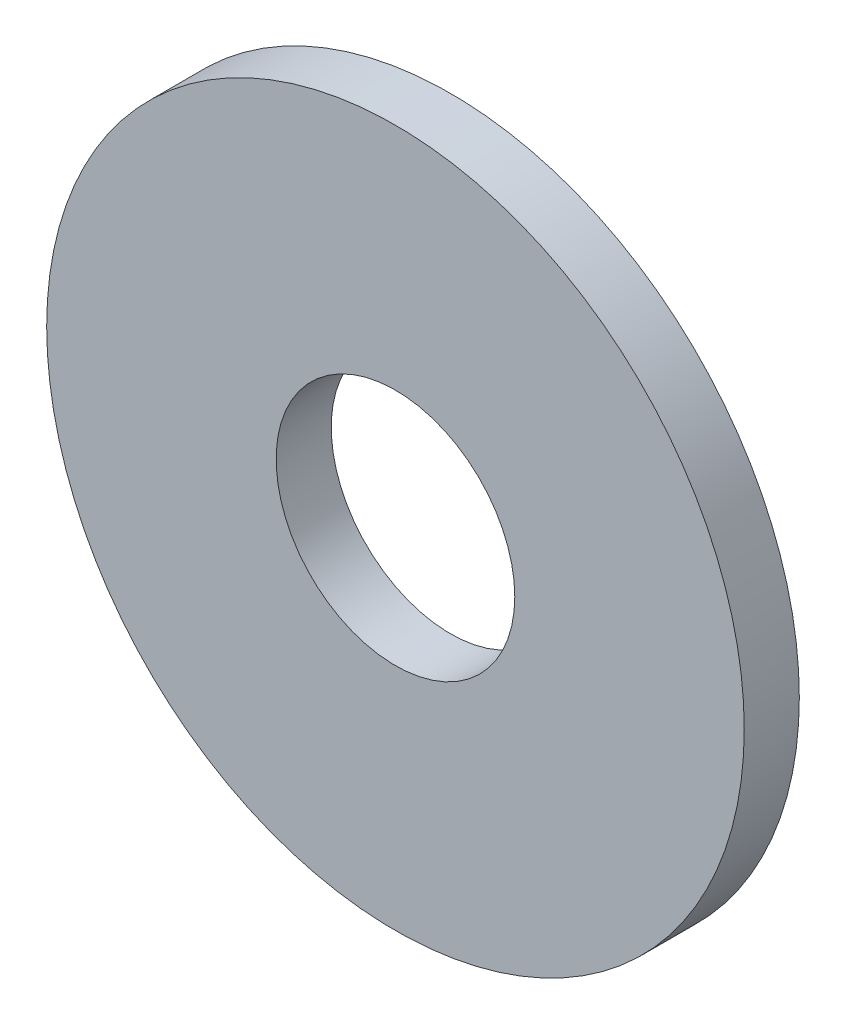
ISO-10303-21;
HEADER;
FILE_DESCRIPTION(('STEP AP214'),'2;1');
FILE_NAME('part.step','',(''),(''),'','','');
FILE_SCHEMA(('AUTOMOTIVE_DESIGN { 1 0 10303 214 1 1 1 1 }'));
ENDSEC;
DATA;
#1=APPLICATION_CONTEXT('core data for automotive mechanical design processes');
#2=APPLICATION_PROTOCOL_DEFINITION('international standard','automotive_design',2000,#1);
#3=PRODUCT_CONTEXT('',#1,'mechanical');
#4=PRODUCT('Part','Part','',(#3));
#5=PRODUCT_RELATED_PRODUCT_CATEGORY('part','',(#4));
#6=PRODUCT_DEFINITION_FORMATION('','',#4);
#7=PRODUCT_DEFINITION_CONTEXT('part definition',#1,'design');
#8=PRODUCT_DEFINITION('design','',#6,#7);
#9=PRODUCT_DEFINITION_SHAPE('','',#8);
#10=(LENGTH_UNIT() NAMED_UNIT(*) SI_UNIT(.MILLI.,.METRE.));
#11=(NAMED_UNIT(*) PLANE_ANGLE_UNIT() SI_UNIT($,.RADIAN.));
#12=(NAMED_UNIT(*) SI_UNIT($,.STERADIAN.) SOLID_ANGLE_UNIT());
#13=UNCERTAINTY_MEASURE_WITH_UNIT(LENGTH_MEASURE(1.E-05),#10,'distance_accuracy_value','');
#14=(GEOMETRIC_REPRESENTATION_CONTEXT(3) GLOBAL_UNCERTAINTY_ASSIGNED_CONTEXT((#13)) GLOBAL_UNIT_ASSIGNED_CONTEXT((#10,
#11,#12)) REPRESENTATION_CONTEXT('',''));
#15=CARTESIAN_POINT('',(0.,0.,0.));
#16=DIRECTION('',(0.,0.,1.));
#17=DIRECTION('',(1.,0.,0.));
#18=AXIS2_PLACEMENT_3D('',#15,#16,#17);
#19=CARTESIAN_POINT('',(0.,0.,0.3));
#20=DIRECTION('',(0.,0.,1.));
#21=DIRECTION('',(1.,0.,0.));
#22=AXIS2_PLACEMENT_3D('',#19,#20,#21);
#23=PLANE('',#22);
#24=CARTESIAN_POINT('',(0.,0.,0.3));
#25=DIRECTION('',(0.,0.,1.));
#26=DIRECTION('',(1.,0.,0.));
#27=AXIS2_PLACEMENT_3D('',#24,#25,#26);
#28=CIRCLE('',#27,1.9);
#29=CARTESIAN_POINT('',(1.9,0.,0.3));
#30=VERTEX_POINT('',#29);
#31=EDGE_CURVE('E10',#30,#30,#28,.T.);
#32=ORIENTED_EDGE('',*,*,#31,.T.);
#33=EDGE_LOOP('',(#32));
#34=FACE_BOUND('',#33,.T.);
#35=CARTESIAN_POINT('',(0.,0.,0.3));
#36=DIRECTION('',(0.,0.,1.));
#37=DIRECTION('',(1.,0.,0.));
#38=AXIS2_PLACEMENT_3D('',#35,#36,#37);
#39=CIRCLE('',#38,0.65);
#40=CARTESIAN_POINT('',(0.65,0.,0.3));
#41=VERTEX_POINT('',#40);
#42=EDGE_CURVE('E50',#41,#41,#39,.T.);
#43=ORIENTED_EDGE('',*,*,#42,.F.);
#44=EDGE_LOOP('',(#43));
#45=FACE_BOUND('',#44,.T.);
#46=ADVANCED_FACE('F37',(#34,#45),#23,.T.);
#47=CARTESIAN_POINT('',(0.,0.,0.));
#48=DIRECTION('',(0.,0.,1.));
#49=DIRECTION('',(1.,0.,0.));
#50=AXIS2_PLACEMENT_3D('',#47,#48,#49);
#51=PLANE('',#50);
#52=CARTESIAN_POINT('',(0.,0.,0.));
#53=DIRECTION('',(0.,0.,1.));
#54=DIRECTION('',(1.,0.,0.));
#55=AXIS2_PLACEMENT_3D('',#52,#53,#54);
#56=CIRCLE('',#55,1.9);
#57=CARTESIAN_POINT('',(1.9,0.,0.));
#58=VERTEX_POINT('',#57);
#59=EDGE_CURVE('E41',#58,#58,#56,.T.);
#60=ORIENTED_EDGE('',*,*,#59,.F.);
#61=EDGE_LOOP('',(#60));
#62=FACE_BOUND('',#61,.T.);
#63=CARTESIAN_POINT('',(0.,0.,0.));
#64=DIRECTION('',(0.,0.,1.));
#65=DIRECTION('',(1.,0.,0.));
#66=AXIS2_PLACEMENT_3D('',#63,#64,#65);
#67=CIRCLE('',#66,0.65);
#68=CARTESIAN_POINT('',(0.65,0.,0.));
#69=VERTEX_POINT('',#68);
#70=EDGE_CURVE('E52',#69,#69,#67,.T.);
#71=ORIENTED_EDGE('',*,*,#70,.T.);
#72=EDGE_LOOP('',(#71));
#73=FACE_BOUND('',#72,.T.);
#74=ADVANCED_FACE('F64',(#62,#73),#51,.F.);
#75=CARTESIAN_POINT('',(0.,0.,0.3));
#76=DIRECTION('',(0.,0.,-1.));
#77=DIRECTION('',(-1.,0.,0.));
#78=AXIS2_PLACEMENT_3D('',#75,#76,#77);
#79=CYLINDRICAL_SURFACE('',#78,1.9);
#80=ORIENTED_EDGE('',*,*,#31,.F.);
#81=EDGE_LOOP('',(#80));
#82=FACE_BOUND('',#81,.T.);
#83=ORIENTED_EDGE('',*,*,#59,.T.);
#84=EDGE_LOOP('',(#83));
#85=FACE_BOUND('',#84,.T.);
#86=ADVANCED_FACE('F39',(#82,#85),#79,.T.);
#87=CARTESIAN_POINT('',(0.,0.,0.3));
#88=DIRECTION('',(0.,0.,-1.));
#89=DIRECTION('',(-1.,0.,0.));
#90=AXIS2_PLACEMENT_3D('',#87,#88,#89);
#91=CYLINDRICAL_SURFACE('',#90,0.65);
#92=ORIENTED_EDGE('',*,*,#42,.T.);
#93=EDGE_LOOP('',(#92));
#94=FACE_BOUND('',#93,.T.);
#95=ORIENTED_EDGE('',*,*,#70,.F.);
#96=EDGE_LOOP('',(#95));
#97=FACE_BOUND('',#96,.T.);
#98=ADVANCED_FACE('F60',(#94,#97),#91,.F.);
#99=CLOSED_SHELL('',(#46,#74,#86,#98));
#100=MANIFOLD_SOLID_BREP('B2',#99);
#101=ADVANCED_BREP_SHAPE_REPRESENTATION('',(#18,#100),#14);
#102=SHAPE_DEFINITION_REPRESENTATION(#9,#101);
ENDSEC;
END-ISO-10303-21;
